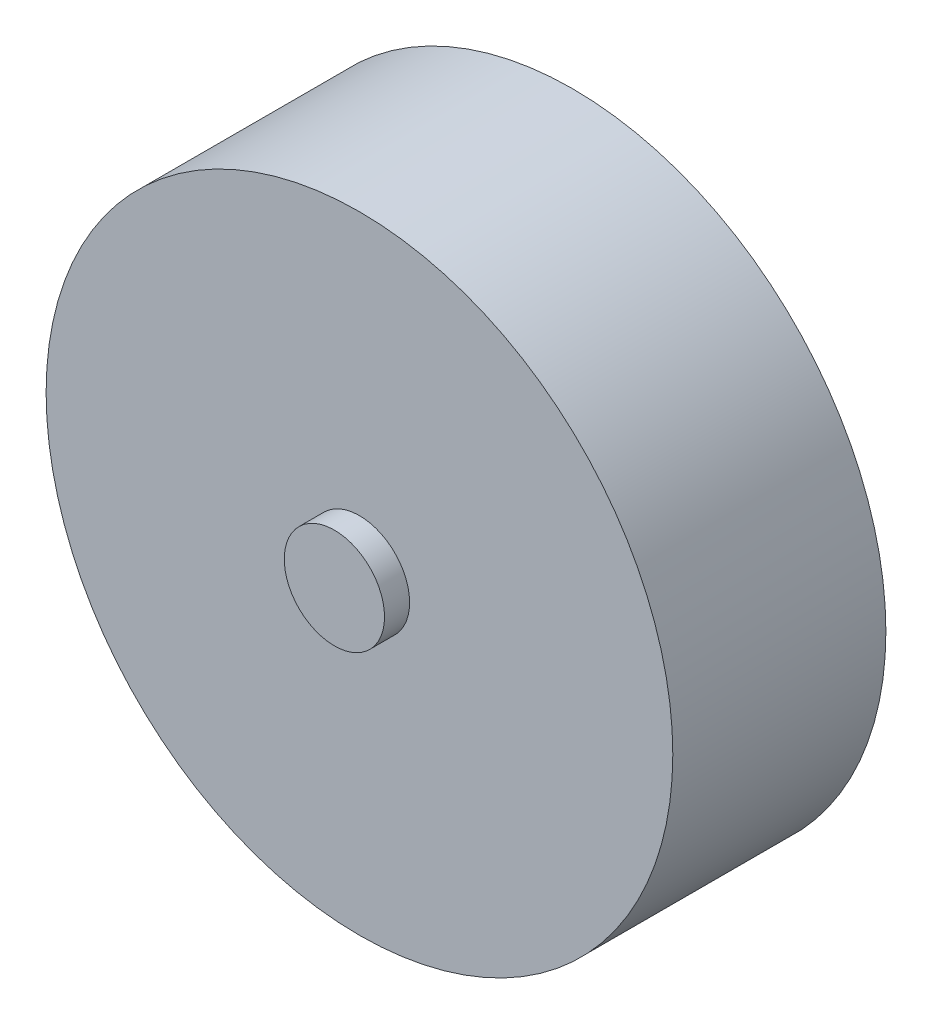
ISO-10303-21;
HEADER;
FILE_DESCRIPTION(('STEP AP214'),'2;1');
FILE_NAME('part.step','',(''),(''),'','','');
FILE_SCHEMA(('AUTOMOTIVE_DESIGN { 1 0 10303 214 1 1 1 1 }'));
ENDSEC;
DATA;
#1=APPLICATION_CONTEXT('core data for automotive mechanical design processes');
#2=APPLICATION_PROTOCOL_DEFINITION('international standard','automotive_design',2000,#1);
#3=PRODUCT_CONTEXT('',#1,'mechanical');
#4=PRODUCT('Part','Part','',(#3));
#5=PRODUCT_RELATED_PRODUCT_CATEGORY('part','',(#4));
#6=PRODUCT_DEFINITION_FORMATION('','',#4);
#7=PRODUCT_DEFINITION_CONTEXT('part definition',#1,'design');
#8=PRODUCT_DEFINITION('design','',#6,#7);
#9=PRODUCT_DEFINITION_SHAPE('','',#8);
#10=(LENGTH_UNIT() NAMED_UNIT(*) SI_UNIT(.MILLI.,.METRE.));
#11=(NAMED_UNIT(*) PLANE_ANGLE_UNIT() SI_UNIT($,.RADIAN.));
#12=(NAMED_UNIT(*) SI_UNIT($,.STERADIAN.) SOLID_ANGLE_UNIT());
#13=UNCERTAINTY_MEASURE_WITH_UNIT(LENGTH_MEASURE(1.E-05),#10,'distance_accuracy_value','');
#14=(GEOMETRIC_REPRESENTATION_CONTEXT(3) GLOBAL_UNCERTAINTY_ASSIGNED_CONTEXT((#13)) GLOBAL_UNIT_ASSIGNED_CONTEXT((#10,
#11,#12)) REPRESENTATION_CONTEXT('',''));
#15=CARTESIAN_POINT('',(0.,0.,0.));
#16=DIRECTION('',(0.,0.,1.));
#17=DIRECTION('',(1.,0.,0.));
#18=AXIS2_PLACEMENT_3D('',#15,#16,#17);
#19=CARTESIAN_POINT('',(0.,0.,170.));
#20=DIRECTION('',(0.,0.,-1.));
#21=DIRECTION('',(-1.,0.,0.));
#22=AXIS2_PLACEMENT_3D('',#19,#20,#21);
#23=CYLINDRICAL_SURFACE('',#22,250.);
#24=CARTESIAN_POINT('',(0.,0.,170.));
#25=DIRECTION('',(0.,0.,1.));
#26=DIRECTION('',(1.,0.,0.));
#27=AXIS2_PLACEMENT_3D('',#24,#25,#26);
#28=CIRCLE('',#27,250.);
#29=CARTESIAN_POINT('',(250.,0.,170.));
#30=VERTEX_POINT('',#29);
#31=EDGE_CURVE('E45',#30,#30,#28,.T.);
#32=ORIENTED_EDGE('',*,*,#31,.F.);
#33=EDGE_LOOP('',(#32));
#34=FACE_BOUND('',#33,.T.);
#35=CARTESIAN_POINT('',(0.,0.,0.));
#36=DIRECTION('',(0.,0.,1.));
#37=DIRECTION('',(1.,0.,0.));
#38=AXIS2_PLACEMENT_3D('',#35,#36,#37);
#39=CIRCLE('',#38,250.);
#40=CARTESIAN_POINT('',(250.,0.,0.));
#41=VERTEX_POINT('',#40);
#42=EDGE_CURVE('E51',#41,#41,#39,.T.);
#43=ORIENTED_EDGE('',*,*,#42,.T.);
#44=EDGE_LOOP('',(#43));
#45=FACE_BOUND('',#44,.T.);
#46=ADVANCED_FACE('F37',(#34,#45),#23,.T.);
#47=CARTESIAN_POINT('',(0.,0.,170.));
#48=DIRECTION('',(0.,0.,1.));
#49=DIRECTION('',(1.,0.,0.));
#50=AXIS2_PLACEMENT_3D('',#47,#48,#49);
#51=PLANE('',#50);
#52=CARTESIAN_POINT('',(0.,0.,170.));
#53=DIRECTION('',(0.,0.,1.));
#54=DIRECTION('',(1.,0.,0.));
#55=AXIS2_PLACEMENT_3D('',#52,#53,#54);
#56=CIRCLE('',#55,40.);
#57=CARTESIAN_POINT('',(40.,0.,170.));
#58=VERTEX_POINT('',#57);
#59=EDGE_CURVE('E10',#58,#58,#56,.T.);
#60=ORIENTED_EDGE('',*,*,#59,.F.);
#61=EDGE_LOOP('',(#60));
#62=FACE_BOUND('',#61,.T.);
#63=ORIENTED_EDGE('',*,*,#31,.T.);
#64=EDGE_LOOP('',(#63));
#65=FACE_BOUND('',#64,.T.);
#66=ADVANCED_FACE('F88',(#62,#65),#51,.T.);
#67=CARTESIAN_POINT('',(0.,0.,0.));
#68=DIRECTION('',(0.,0.,1.));
#69=DIRECTION('',(1.,0.,0.));
#70=AXIS2_PLACEMENT_3D('',#67,#68,#69);
#71=PLANE('',#70);
#72=CARTESIAN_POINT('',(0.,0.,0.));
#73=DIRECTION('',(0.,0.,1.));
#74=DIRECTION('',(1.,0.,0.));
#75=AXIS2_PLACEMENT_3D('',#72,#73,#74);
#76=CIRCLE('',#75,40.);
#77=CARTESIAN_POINT('',(40.,0.,0.));
#78=VERTEX_POINT('',#77);
#79=EDGE_CURVE('E40',#78,#78,#76,.T.);
#80=ORIENTED_EDGE('',*,*,#79,.T.);
#81=EDGE_LOOP('',(#80));
#82=FACE_BOUND('',#81,.T.);
#83=ORIENTED_EDGE('',*,*,#42,.F.);
#84=EDGE_LOOP('',(#83));
#85=FACE_BOUND('',#84,.T.);
#86=ADVANCED_FACE('F93',(#82,#85),#71,.F.);
#87=CARTESIAN_POINT('',(0.,0.,-20.));
#88=DIRECTION('',(0.,0.,1.));
#89=DIRECTION('',(1.,0.,0.));
#90=AXIS2_PLACEMENT_3D('',#87,#88,#89);
#91=PLANE('',#90);
#92=CARTESIAN_POINT('',(0.,0.,-20.));
#93=DIRECTION('',(0.,0.,1.));
#94=DIRECTION('',(1.,0.,0.));
#95=AXIS2_PLACEMENT_3D('',#92,#93,#94);
#96=CIRCLE('',#95,40.);
#97=CARTESIAN_POINT('',(40.,0.,-20.));
#98=VERTEX_POINT('',#97);
#99=EDGE_CURVE('E54',#98,#98,#96,.T.);
#100=ORIENTED_EDGE('',*,*,#99,.F.);
#101=EDGE_LOOP('',(#100));
#102=FACE_BOUND('',#101,.T.);
#103=ADVANCED_FACE('F84',(#102),#91,.F.);
#104=CARTESIAN_POINT('',(0.,0.,-20.));
#105=DIRECTION('',(0.,0.,1.));
#106=DIRECTION('',(1.,0.,0.));
#107=AXIS2_PLACEMENT_3D('',#104,#105,#106);
#108=CYLINDRICAL_SURFACE('',#107,40.);
#109=ORIENTED_EDGE('',*,*,#99,.T.);
#110=EDGE_LOOP('',(#109));
#111=FACE_BOUND('',#110,.T.);
#112=ORIENTED_EDGE('',*,*,#79,.F.);
#113=EDGE_LOOP('',(#112));
#114=FACE_BOUND('',#113,.T.);
#115=ADVANCED_FACE('F77',(#111,#114),#108,.T.);
#116=ORIENTED_EDGE('',*,*,#59,.T.);
#117=EDGE_LOOP('',(#116));
#118=FACE_BOUND('',#117,.T.);
#119=CARTESIAN_POINT('',(0.,0.,190.));
#120=DIRECTION('',(0.,0.,1.));
#121=DIRECTION('',(1.,0.,0.));
#122=AXIS2_PLACEMENT_3D('',#119,#120,#121);
#123=CIRCLE('',#122,40.);
#124=CARTESIAN_POINT('',(40.,0.,190.));
#125=VERTEX_POINT('',#124);
#126=EDGE_CURVE('E66',#125,#125,#123,.T.);
#127=ORIENTED_EDGE('',*,*,#126,.F.);
#128=EDGE_LOOP('',(#127));
#129=FACE_BOUND('',#128,.T.);
#130=ADVANCED_FACE('F75',(#118,#129),#108,.T.);
#131=CARTESIAN_POINT('',(0.,0.,190.));
#132=DIRECTION('',(0.,0.,1.));
#133=DIRECTION('',(1.,0.,0.));
#134=AXIS2_PLACEMENT_3D('',#131,#132,#133);
#135=PLANE('',#134);
#136=ORIENTED_EDGE('',*,*,#126,.T.);
#137=EDGE_LOOP('',(#136));
#138=FACE_BOUND('',#137,.T.);
#139=ADVANCED_FACE('F73',(#138),#135,.T.);
#140=CLOSED_SHELL('',(#46,#66,#86,#103,#115,#130,#139));
#141=MANIFOLD_SOLID_BREP('B2',#140);
#142=ADVANCED_BREP_SHAPE_REPRESENTATION('',(#18,#141),#14);
#143=SHAPE_DEFINITION_REPRESENTATION(#9,#142);
ENDSEC;
END-ISO-10303-21;
